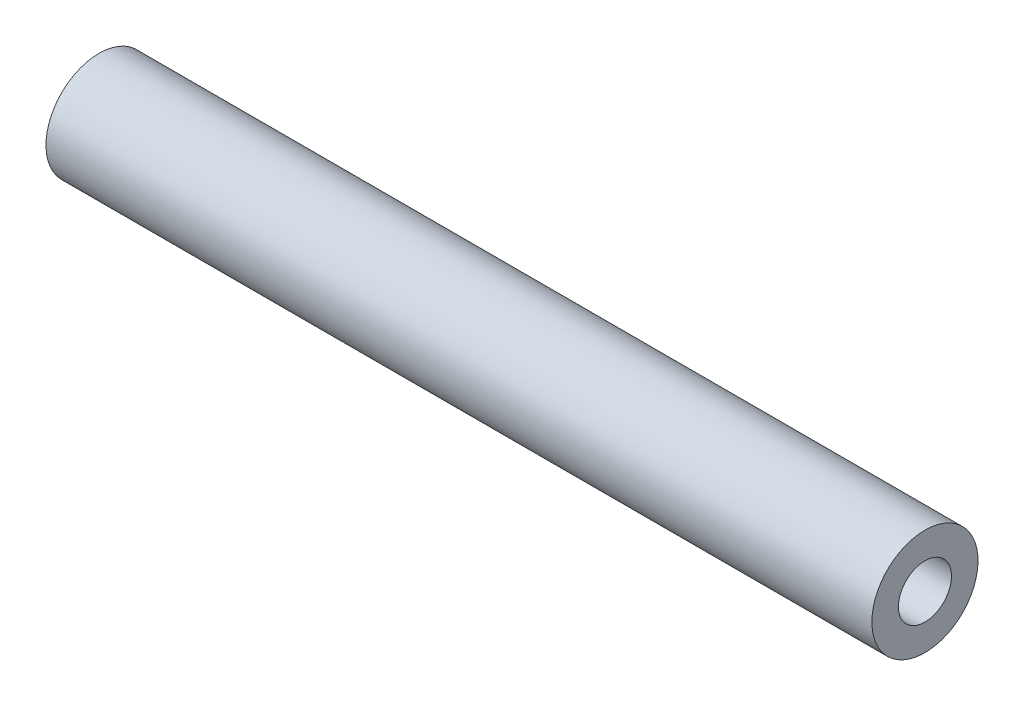
ISO-10303-21;
HEADER;
FILE_DESCRIPTION(('STEP AP214'),'2;1');
FILE_NAME('part.step','',(''),(''),'','','');
FILE_SCHEMA(('AUTOMOTIVE_DESIGN { 1 0 10303 214 1 1 1 1 }'));
ENDSEC;
DATA;
#1=APPLICATION_CONTEXT('core data for automotive mechanical design processes');
#2=APPLICATION_PROTOCOL_DEFINITION('international standard','automotive_design',2000,#1);
#3=PRODUCT_CONTEXT('',#1,'mechanical');
#4=PRODUCT('Part','Part','',(#3));
#5=PRODUCT_RELATED_PRODUCT_CATEGORY('part','',(#4));
#6=PRODUCT_DEFINITION_FORMATION('','',#4);
#7=PRODUCT_DEFINITION_CONTEXT('part definition',#1,'design');
#8=PRODUCT_DEFINITION('design','',#6,#7);
#9=PRODUCT_DEFINITION_SHAPE('','',#8);
#10=(LENGTH_UNIT() NAMED_UNIT(*) SI_UNIT(.MILLI.,.METRE.));
#11=(NAMED_UNIT(*) PLANE_ANGLE_UNIT() SI_UNIT($,.RADIAN.));
#12=(NAMED_UNIT(*) SI_UNIT($,.STERADIAN.) SOLID_ANGLE_UNIT());
#13=UNCERTAINTY_MEASURE_WITH_UNIT(LENGTH_MEASURE(1.E-05),#10,'distance_accuracy_value','');
#14=(GEOMETRIC_REPRESENTATION_CONTEXT(3) GLOBAL_UNCERTAINTY_ASSIGNED_CONTEXT((#13)) GLOBAL_UNIT_ASSIGNED_CONTEXT((#10,
#11,#12)) REPRESENTATION_CONTEXT('',''));
#15=CARTESIAN_POINT('',(0.,0.,0.));
#16=DIRECTION('',(0.,0.,1.));
#17=DIRECTION('',(1.,0.,0.));
#18=AXIS2_PLACEMENT_3D('',#15,#16,#17);
#19=CARTESIAN_POINT('',(86.106,0.,0.));
#20=DIRECTION('',(1.,0.,0.));
#21=DIRECTION('',(0.,1.,0.));
#22=AXIS2_PLACEMENT_3D('',#19,#20,#21);
#23=CYLINDRICAL_SURFACE('',#22,6.35);
#24=CARTESIAN_POINT('',(0.,0.,0.));
#25=DIRECTION('',(1.,0.,0.));
#26=DIRECTION('',(0.,1.,0.));
#27=AXIS2_PLACEMENT_3D('',#24,#25,#26);
#28=CIRCLE('',#27,6.34999999999999);
#29=CARTESIAN_POINT('',(0.,6.34999999999999,0.));
#30=VERTEX_POINT('',#29);
#31=EDGE_CURVE('E57',#30,#30,#28,.T.);
#32=ORIENTED_EDGE('',*,*,#31,.T.);
#33=EDGE_LOOP('',(#32));
#34=FACE_BOUND('',#33,.T.);
#35=CARTESIAN_POINT('',(98.806,0.,0.));
#36=DIRECTION('',(1.,0.,0.));
#37=DIRECTION('',(0.,1.,0.));
#38=AXIS2_PLACEMENT_3D('',#35,#36,#37);
#39=CIRCLE('',#38,6.35);
#40=CARTESIAN_POINT('',(98.806,6.34999999999999,0.));
#41=VERTEX_POINT('',#40);
#42=EDGE_CURVE('E10',#41,#41,#39,.T.);
#43=ORIENTED_EDGE('',*,*,#42,.F.);
#44=EDGE_LOOP('',(#43));
#45=FACE_BOUND('',#44,.T.);
#46=ADVANCED_FACE('F35',(#34,#45),#23,.T.);
#47=CARTESIAN_POINT('',(98.806,6.34999999999999,0.));
#48=DIRECTION('',(1.,0.,0.));
#49=DIRECTION('',(0.,1.,0.));
#50=AXIS2_PLACEMENT_3D('',#47,#48,#49);
#51=PLANE('',#50);
#52=ORIENTED_EDGE('',*,*,#42,.T.);
#53=EDGE_LOOP('',(#52));
#54=FACE_BOUND('',#53,.T.);
#55=CARTESIAN_POINT('',(98.806,0.,0.));
#56=DIRECTION('',(1.,0.,0.));
#57=DIRECTION('',(0.,1.,0.));
#58=AXIS2_PLACEMENT_3D('',#55,#56,#57);
#59=CIRCLE('',#58,3.175);
#60=CARTESIAN_POINT('',(98.806,3.175,0.));
#61=VERTEX_POINT('',#60);
#62=EDGE_CURVE('E41',#61,#61,#59,.T.);
#63=ORIENTED_EDGE('',*,*,#62,.F.);
#64=EDGE_LOOP('',(#63));
#65=FACE_BOUND('',#64,.T.);
#66=ADVANCED_FACE('F75',(#54,#65),#51,.T.);
#67=CARTESIAN_POINT('',(86.106,0.,0.));
#68=DIRECTION('',(1.,0.,0.));
#69=DIRECTION('',(0.,1.,0.));
#70=AXIS2_PLACEMENT_3D('',#67,#68,#69);
#71=CYLINDRICAL_SURFACE('',#70,3.175);
#72=ORIENTED_EDGE('',*,*,#62,.T.);
#73=EDGE_LOOP('',(#72));
#74=FACE_BOUND('',#73,.T.);
#75=CARTESIAN_POINT('',(86.106,0.,0.));
#76=DIRECTION('',(1.,0.,0.));
#77=DIRECTION('',(0.,1.,0.));
#78=AXIS2_PLACEMENT_3D('',#75,#76,#77);
#79=CIRCLE('',#78,3.175);
#80=CARTESIAN_POINT('',(86.106,3.175,0.));
#81=VERTEX_POINT('',#80);
#82=EDGE_CURVE('E45',#81,#81,#79,.T.);
#83=ORIENTED_EDGE('',*,*,#82,.F.);
#84=EDGE_LOOP('',(#83));
#85=FACE_BOUND('',#84,.T.);
#86=ADVANCED_FACE('F79',(#74,#85),#71,.F.);
#87=CARTESIAN_POINT('',(86.106,0.,0.));
#88=DIRECTION('',(1.,0.,0.));
#89=DIRECTION('',(0.,1.,0.));
#90=AXIS2_PLACEMENT_3D('',#87,#88,#89);
#91=PLANE('',#90);
#92=ORIENTED_EDGE('',*,*,#82,.T.);
#93=EDGE_LOOP('',(#92));
#94=FACE_BOUND('',#93,.T.);
#95=ADVANCED_FACE('F83',(#94),#91,.T.);
#96=CARTESIAN_POINT('',(12.7,0.,0.));
#97=DIRECTION('',(-1.,0.,0.));
#98=DIRECTION('',(0.,-1.,0.));
#99=AXIS2_PLACEMENT_3D('',#96,#97,#98);
#100=PLANE('',#99);
#101=CARTESIAN_POINT('',(12.7,0.,0.));
#102=DIRECTION('',(1.,0.,0.));
#103=DIRECTION('',(0.,1.,0.));
#104=AXIS2_PLACEMENT_3D('',#101,#102,#103);
#105=CIRCLE('',#104,3.175);
#106=CARTESIAN_POINT('',(12.7,3.175,0.));
#107=VERTEX_POINT('',#106);
#108=EDGE_CURVE('E49',#107,#107,#105,.T.);
#109=ORIENTED_EDGE('',*,*,#108,.F.);
#110=EDGE_LOOP('',(#109));
#111=FACE_BOUND('',#110,.T.);
#112=ADVANCED_FACE('F71',(#111),#100,.T.);
#113=CARTESIAN_POINT('',(86.106,0.,0.));
#114=DIRECTION('',(1.,0.,0.));
#115=DIRECTION('',(0.,1.,0.));
#116=AXIS2_PLACEMENT_3D('',#113,#114,#115);
#117=CYLINDRICAL_SURFACE('',#116,3.175);
#118=ORIENTED_EDGE('',*,*,#108,.T.);
#119=EDGE_LOOP('',(#118));
#120=FACE_BOUND('',#119,.T.);
#121=CARTESIAN_POINT('',(0.,0.,0.));
#122=DIRECTION('',(1.,0.,0.));
#123=DIRECTION('',(0.,1.,0.));
#124=AXIS2_PLACEMENT_3D('',#121,#122,#123);
#125=CIRCLE('',#124,3.175);
#126=CARTESIAN_POINT('',(0.,3.175,0.));
#127=VERTEX_POINT('',#126);
#128=EDGE_CURVE('E54',#127,#127,#125,.T.);
#129=ORIENTED_EDGE('',*,*,#128,.F.);
#130=EDGE_LOOP('',(#129));
#131=FACE_BOUND('',#130,.T.);
#132=ADVANCED_FACE('F65',(#120,#131),#117,.F.);
#133=CARTESIAN_POINT('',(0.,3.175,0.));
#134=DIRECTION('',(-1.,0.,0.));
#135=DIRECTION('',(0.,-1.,0.));
#136=AXIS2_PLACEMENT_3D('',#133,#134,#135);
#137=PLANE('',#136);
#138=ORIENTED_EDGE('',*,*,#128,.T.);
#139=EDGE_LOOP('',(#138));
#140=FACE_BOUND('',#139,.T.);
#141=ORIENTED_EDGE('',*,*,#31,.F.);
#142=EDGE_LOOP('',(#141));
#143=FACE_BOUND('',#142,.T.);
#144=ADVANCED_FACE('F63',(#140,#143),#137,.T.);
#145=CLOSED_SHELL('',(#46,#66,#86,#95,#112,#132,#144));
#146=MANIFOLD_SOLID_BREP('B2',#145);
#147=ADVANCED_BREP_SHAPE_REPRESENTATION('',(#18,#146),#14);
#148=SHAPE_DEFINITION_REPRESENTATION(#9,#147);
ENDSEC;
END-ISO-10303-21;
